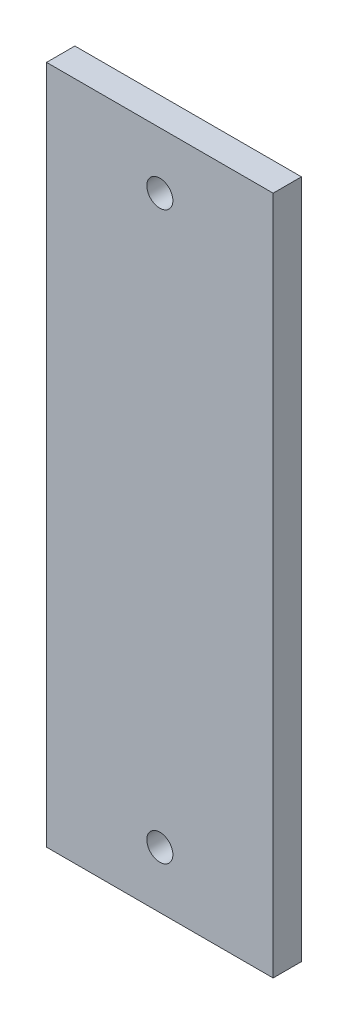
ISO-10303-21;
HEADER;
FILE_DESCRIPTION(('STEP AP214'),'2;1');
FILE_NAME('part.step','',(''),(''),'','','');
FILE_SCHEMA(('AUTOMOTIVE_DESIGN { 1 0 10303 214 1 1 1 1 }'));
ENDSEC;
DATA;
#1=APPLICATION_CONTEXT('core data for automotive mechanical design processes');
#2=APPLICATION_PROTOCOL_DEFINITION('international standard','automotive_design',2000,#1);
#3=PRODUCT_CONTEXT('',#1,'mechanical');
#4=PRODUCT('Part','Part','',(#3));
#5=PRODUCT_RELATED_PRODUCT_CATEGORY('part','',(#4));
#6=PRODUCT_DEFINITION_FORMATION('','',#4);
#7=PRODUCT_DEFINITION_CONTEXT('part definition',#1,'design');
#8=PRODUCT_DEFINITION('design','',#6,#7);
#9=PRODUCT_DEFINITION_SHAPE('','',#8);
#10=(LENGTH_UNIT() NAMED_UNIT(*) SI_UNIT(.MILLI.,.METRE.));
#11=(NAMED_UNIT(*) PLANE_ANGLE_UNIT() SI_UNIT($,.RADIAN.));
#12=(NAMED_UNIT(*) SI_UNIT($,.STERADIAN.) SOLID_ANGLE_UNIT());
#13=UNCERTAINTY_MEASURE_WITH_UNIT(LENGTH_MEASURE(1.E-05),#10,'distance_accuracy_value','');
#14=(GEOMETRIC_REPRESENTATION_CONTEXT(3) GLOBAL_UNCERTAINTY_ASSIGNED_CONTEXT((#13)) GLOBAL_UNIT_ASSIGNED_CONTEXT((#10,
#11,#12)) REPRESENTATION_CONTEXT('',''));
#15=CARTESIAN_POINT('',(0.,0.,0.));
#16=DIRECTION('',(0.,0.,1.));
#17=DIRECTION('',(1.,0.,0.));
#18=AXIS2_PLACEMENT_3D('',#15,#16,#17);
#19=CARTESIAN_POINT('',(0.,0.,3.175));
#20=DIRECTION('',(0.,0.,-1.));
#21=DIRECTION('',(-1.,0.,0.));
#22=AXIS2_PLACEMENT_3D('',#19,#20,#21);
#23=PLANE('',#22);
#24=DIRECTION('',(0.,-1.,0.));
#25=VECTOR('',#24,1.);
#26=CARTESIAN_POINT('',(0.,0.,3.175));
#27=LINE('',#26,#25);
#28=CARTESIAN_POINT('',(0.,76.2,3.175));
#29=VERTEX_POINT('',#28);
#30=CARTESIAN_POINT('',(0.,0.,3.175));
#31=VERTEX_POINT('',#30);
#32=EDGE_CURVE('E98',#29,#31,#27,.T.);
#33=ORIENTED_EDGE('',*,*,#32,.T.);
#34=DIRECTION('',(1.,0.,0.));
#35=VECTOR('',#34,1.);
#36=CARTESIAN_POINT('',(0.,0.,3.175));
#37=LINE('',#36,#35);
#38=CARTESIAN_POINT('',(25.4,0.,3.175));
#39=VERTEX_POINT('',#38);
#40=EDGE_CURVE('E93',#31,#39,#37,.T.);
#41=ORIENTED_EDGE('',*,*,#40,.T.);
#42=DIRECTION('',(0.,1.,0.));
#43=VECTOR('',#42,1.);
#44=CARTESIAN_POINT('',(25.4,0.,3.175));
#45=LINE('',#44,#43);
#46=CARTESIAN_POINT('',(25.4,76.2,3.175));
#47=VERTEX_POINT('',#46);
#48=EDGE_CURVE('E96',#39,#47,#45,.T.);
#49=ORIENTED_EDGE('',*,*,#48,.T.);
#50=DIRECTION('',(-1.,0.,0.));
#51=VECTOR('',#50,1.);
#52=CARTESIAN_POINT('',(0.,76.2,3.175));
#53=LINE('',#52,#51);
#54=EDGE_CURVE('E63',#47,#29,#53,.T.);
#55=ORIENTED_EDGE('',*,*,#54,.T.);
#56=EDGE_LOOP('',(#33,#41,#49,#55));
#57=FACE_BOUND('',#56,.T.);
#58=CARTESIAN_POINT('',(12.7,69.85,3.175));
#59=DIRECTION('',(0.,0.,1.));
#60=DIRECTION('',(1.,0.,0.));
#61=AXIS2_PLACEMENT_3D('',#58,#59,#60);
#62=CIRCLE('',#61,1.4605);
#63=CARTESIAN_POINT('',(14.1605,69.85,3.175));
#64=VERTEX_POINT('',#63);
#65=EDGE_CURVE('E118',#64,#64,#62,.T.);
#66=ORIENTED_EDGE('',*,*,#65,.F.);
#67=EDGE_LOOP('',(#66));
#68=FACE_BOUND('',#67,.T.);
#69=CARTESIAN_POINT('',(12.7,6.35,3.175));
#70=DIRECTION('',(0.,0.,1.));
#71=DIRECTION('',(1.,0.,0.));
#72=AXIS2_PLACEMENT_3D('',#69,#70,#71);
#73=CIRCLE('',#72,1.4605);
#74=CARTESIAN_POINT('',(14.1605,6.35,3.175));
#75=VERTEX_POINT('',#74);
#76=EDGE_CURVE('E140',#75,#75,#73,.T.);
#77=ORIENTED_EDGE('',*,*,#76,.F.);
#78=EDGE_LOOP('',(#77));
#79=FACE_BOUND('',#78,.T.);
#80=ADVANCED_FACE('F45',(#57,#68,#79),#23,.F.);
#81=CARTESIAN_POINT('',(0.,0.,0.));
#82=DIRECTION('',(0.,0.,-1.));
#83=DIRECTION('',(-1.,0.,0.));
#84=AXIS2_PLACEMENT_3D('',#81,#82,#83);
#85=PLANE('',#84);
#86=CARTESIAN_POINT('',(12.7,69.85,0.));
#87=DIRECTION('',(0.,0.,1.));
#88=DIRECTION('',(1.,0.,0.));
#89=AXIS2_PLACEMENT_3D('',#86,#87,#88);
#90=CIRCLE('',#89,1.4605);
#91=CARTESIAN_POINT('',(14.1605,69.85,0.));
#92=VERTEX_POINT('',#91);
#93=EDGE_CURVE('E136',#92,#92,#90,.T.);
#94=ORIENTED_EDGE('',*,*,#93,.T.);
#95=EDGE_LOOP('',(#94));
#96=FACE_BOUND('',#95,.T.);
#97=DIRECTION('',(0.,-1.,0.));
#98=VECTOR('',#97,1.);
#99=CARTESIAN_POINT('',(0.,0.,0.));
#100=LINE('',#99,#98);
#101=CARTESIAN_POINT('',(0.,76.2,0.));
#102=VERTEX_POINT('',#101);
#103=CARTESIAN_POINT('',(0.,0.,0.));
#104=VERTEX_POINT('',#103);
#105=EDGE_CURVE('E114',#102,#104,#100,.T.);
#106=ORIENTED_EDGE('',*,*,#105,.F.);
#107=DIRECTION('',(-1.,0.,0.));
#108=VECTOR('',#107,1.);
#109=CARTESIAN_POINT('',(0.,76.2,0.));
#110=LINE('',#109,#108);
#111=CARTESIAN_POINT('',(25.4,76.2,0.));
#112=VERTEX_POINT('',#111);
#113=EDGE_CURVE('E86',#112,#102,#110,.T.);
#114=ORIENTED_EDGE('',*,*,#113,.F.);
#115=DIRECTION('',(0.,1.,0.));
#116=VECTOR('',#115,1.);
#117=CARTESIAN_POINT('',(25.4,0.,0.));
#118=LINE('',#117,#116);
#119=CARTESIAN_POINT('',(25.4,0.,0.));
#120=VERTEX_POINT('',#119);
#121=EDGE_CURVE('E80',#120,#112,#118,.T.);
#122=ORIENTED_EDGE('',*,*,#121,.F.);
#123=DIRECTION('',(1.,0.,0.));
#124=VECTOR('',#123,1.);
#125=CARTESIAN_POINT('',(0.,0.,0.));
#126=LINE('',#125,#124);
#127=EDGE_CURVE('E103',#104,#120,#126,.T.);
#128=ORIENTED_EDGE('',*,*,#127,.F.);
#129=EDGE_LOOP('',(#106,#114,#122,#128));
#130=FACE_BOUND('',#129,.T.);
#131=CARTESIAN_POINT('',(12.7,6.35,0.));
#132=DIRECTION('',(0.,0.,1.));
#133=DIRECTION('',(1.,0.,0.));
#134=AXIS2_PLACEMENT_3D('',#131,#132,#133);
#135=CIRCLE('',#134,1.4605);
#136=CARTESIAN_POINT('',(14.1605,6.35,0.));
#137=VERTEX_POINT('',#136);
#138=EDGE_CURVE('E144',#137,#137,#135,.T.);
#139=ORIENTED_EDGE('',*,*,#138,.T.);
#140=EDGE_LOOP('',(#139));
#141=FACE_BOUND('',#140,.T.);
#142=ADVANCED_FACE('F131',(#96,#130,#141),#85,.T.);
#143=CARTESIAN_POINT('',(0.,0.,3.175));
#144=DIRECTION('',(1.,0.,0.));
#145=DIRECTION('',(0.,0.,-1.));
#146=AXIS2_PLACEMENT_3D('',#143,#144,#145);
#147=PLANE('',#146);
#148=ORIENTED_EDGE('',*,*,#105,.T.);
#149=DIRECTION('',(0.,0.,-1.));
#150=VECTOR('',#149,1.);
#151=CARTESIAN_POINT('',(0.,0.,3.175));
#152=LINE('',#151,#150);
#153=EDGE_CURVE('E11',#31,#104,#152,.T.);
#154=ORIENTED_EDGE('',*,*,#153,.F.);
#155=ORIENTED_EDGE('',*,*,#32,.F.);
#156=DIRECTION('',(0.,0.,-1.));
#157=VECTOR('',#156,1.);
#158=CARTESIAN_POINT('',(0.,76.2,3.175));
#159=LINE('',#158,#157);
#160=EDGE_CURVE('E110',#29,#102,#159,.T.);
#161=ORIENTED_EDGE('',*,*,#160,.T.);
#162=EDGE_LOOP('',(#148,#154,#155,#161));
#163=FACE_BOUND('',#162,.T.);
#164=ADVANCED_FACE('F47',(#163),#147,.F.);
#165=CARTESIAN_POINT('',(0.,0.,3.175));
#166=DIRECTION('',(0.,1.,0.));
#167=DIRECTION('',(0.,0.,1.));
#168=AXIS2_PLACEMENT_3D('',#165,#166,#167);
#169=PLANE('',#168);
#170=ORIENTED_EDGE('',*,*,#127,.T.);
#171=DIRECTION('',(0.,0.,-1.));
#172=VECTOR('',#171,1.);
#173=CARTESIAN_POINT('',(25.4,0.,3.175));
#174=LINE('',#173,#172);
#175=EDGE_CURVE('E55',#39,#120,#174,.T.);
#176=ORIENTED_EDGE('',*,*,#175,.F.);
#177=ORIENTED_EDGE('',*,*,#40,.F.);
#178=ORIENTED_EDGE('',*,*,#153,.T.);
#179=EDGE_LOOP('',(#170,#176,#177,#178));
#180=FACE_BOUND('',#179,.T.);
#181=ADVANCED_FACE('F102',(#180),#169,.F.);
#182=CARTESIAN_POINT('',(25.4,0.,3.175));
#183=DIRECTION('',(-1.,0.,0.));
#184=DIRECTION('',(0.,0.,1.));
#185=AXIS2_PLACEMENT_3D('',#182,#183,#184);
#186=PLANE('',#185);
#187=ORIENTED_EDGE('',*,*,#121,.T.);
#188=DIRECTION('',(0.,0.,-1.));
#189=VECTOR('',#188,1.);
#190=CARTESIAN_POINT('',(25.4,76.2,3.175));
#191=LINE('',#190,#189);
#192=EDGE_CURVE('E105',#47,#112,#191,.T.);
#193=ORIENTED_EDGE('',*,*,#192,.F.);
#194=ORIENTED_EDGE('',*,*,#48,.F.);
#195=ORIENTED_EDGE('',*,*,#175,.T.);
#196=EDGE_LOOP('',(#187,#193,#194,#195));
#197=FACE_BOUND('',#196,.T.);
#198=ADVANCED_FACE('F106',(#197),#186,.F.);
#199=CARTESIAN_POINT('',(0.,76.2,3.175));
#200=DIRECTION('',(0.,-1.,0.));
#201=DIRECTION('',(0.,0.,-1.));
#202=AXIS2_PLACEMENT_3D('',#199,#200,#201);
#203=PLANE('',#202);
#204=ORIENTED_EDGE('',*,*,#113,.T.);
#205=ORIENTED_EDGE('',*,*,#160,.F.);
#206=ORIENTED_EDGE('',*,*,#54,.F.);
#207=ORIENTED_EDGE('',*,*,#192,.T.);
#208=EDGE_LOOP('',(#204,#205,#206,#207));
#209=FACE_BOUND('',#208,.T.);
#210=ADVANCED_FACE('F128',(#209),#203,.F.);
#211=CARTESIAN_POINT('',(12.7,69.85,3.175));
#212=DIRECTION('',(0.,0.,-1.));
#213=DIRECTION('',(-1.,0.,0.));
#214=AXIS2_PLACEMENT_3D('',#211,#212,#213);
#215=CYLINDRICAL_SURFACE('',#214,1.4605);
#216=ORIENTED_EDGE('',*,*,#65,.T.);
#217=EDGE_LOOP('',(#216));
#218=FACE_BOUND('',#217,.T.);
#219=ORIENTED_EDGE('',*,*,#93,.F.);
#220=EDGE_LOOP('',(#219));
#221=FACE_BOUND('',#220,.T.);
#222=ADVANCED_FACE('F163',(#218,#221),#215,.F.);
#223=CARTESIAN_POINT('',(12.7,6.35,3.175));
#224=DIRECTION('',(0.,0.,-1.));
#225=DIRECTION('',(-1.,0.,0.));
#226=AXIS2_PLACEMENT_3D('',#223,#224,#225);
#227=CYLINDRICAL_SURFACE('',#226,1.4605);
#228=ORIENTED_EDGE('',*,*,#76,.T.);
#229=EDGE_LOOP('',(#228));
#230=FACE_BOUND('',#229,.T.);
#231=ORIENTED_EDGE('',*,*,#138,.F.);
#232=EDGE_LOOP('',(#231));
#233=FACE_BOUND('',#232,.T.);
#234=ADVANCED_FACE('F152',(#230,#233),#227,.F.);
#235=CLOSED_SHELL('',(#80,#142,#164,#181,#198,#210,#222,#234));
#236=MANIFOLD_SOLID_BREP('B2',#235);
#237=ADVANCED_BREP_SHAPE_REPRESENTATION('',(#18,#236),#14);
#238=SHAPE_DEFINITION_REPRESENTATION(#9,#237);
ENDSEC;
END-ISO-10303-21;
